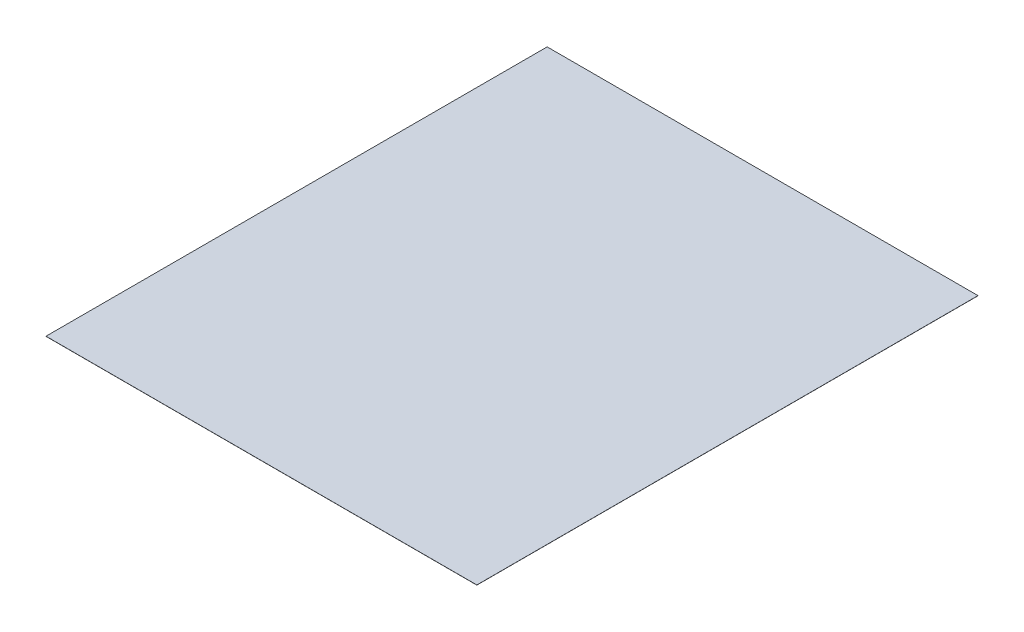
ISO-10303-21;
HEADER;
FILE_DESCRIPTION(('STEP AP214'),'2;1');
FILE_NAME('part.step','',(''),(''),'','','');
FILE_SCHEMA(('AUTOMOTIVE_DESIGN { 1 0 10303 214 1 1 1 1 }'));
ENDSEC;
DATA;
#1=APPLICATION_CONTEXT('core data for automotive mechanical design processes');
#2=APPLICATION_PROTOCOL_DEFINITION('international standard','automotive_design',2000,#1);
#3=PRODUCT_CONTEXT('',#1,'mechanical');
#4=PRODUCT('Part','Part','',(#3));
#5=PRODUCT_RELATED_PRODUCT_CATEGORY('part','',(#4));
#6=PRODUCT_DEFINITION_FORMATION('','',#4);
#7=PRODUCT_DEFINITION_CONTEXT('part definition',#1,'design');
#8=PRODUCT_DEFINITION('design','',#6,#7);
#9=PRODUCT_DEFINITION_SHAPE('','',#8);
#10=(LENGTH_UNIT() NAMED_UNIT(*) SI_UNIT(.MILLI.,.METRE.));
#11=(NAMED_UNIT(*) PLANE_ANGLE_UNIT() SI_UNIT($,.RADIAN.));
#12=(NAMED_UNIT(*) SI_UNIT($,.STERADIAN.) SOLID_ANGLE_UNIT());
#13=UNCERTAINTY_MEASURE_WITH_UNIT(LENGTH_MEASURE(1.E-05),#10,'distance_accuracy_value','');
#14=(GEOMETRIC_REPRESENTATION_CONTEXT(3) GLOBAL_UNCERTAINTY_ASSIGNED_CONTEXT((#13)) GLOBAL_UNIT_ASSIGNED_CONTEXT((#10,
#11,#12)) REPRESENTATION_CONTEXT('',''));
#15=CARTESIAN_POINT('',(0.,0.,0.));
#16=DIRECTION('',(0.,0.,1.));
#17=DIRECTION('',(1.,0.,0.));
#18=AXIS2_PLACEMENT_3D('',#15,#16,#17);
#19=CARTESIAN_POINT('',(0.,2.54,0.));
#20=DIRECTION('',(1.,0.,0.));
#21=DIRECTION('',(0.,0.,-1.));
#22=AXIS2_PLACEMENT_3D('',#19,#20,#21);
#23=PLANE('',#22);
#24=DIRECTION('',(0.,0.,1.));
#25=VECTOR('',#24,1.);
#26=CARTESIAN_POINT('',(0.,0.,0.));
#27=LINE('',#26,#25);
#28=CARTESIAN_POINT('',(0.,0.,-8509.));
#29=VERTEX_POINT('',#28);
#30=CARTESIAN_POINT('',(0.,0.,0.));
#31=VERTEX_POINT('',#30);
#32=EDGE_CURVE('E96',#29,#31,#27,.T.);
#33=ORIENTED_EDGE('',*,*,#32,.T.);
#34=DIRECTION('',(0.,-1.,0.));
#35=VECTOR('',#34,1.);
#36=CARTESIAN_POINT('',(0.,2.54,0.));
#37=LINE('',#36,#35);
#38=CARTESIAN_POINT('',(0.,2.54,0.));
#39=VERTEX_POINT('',#38);
#40=EDGE_CURVE('E11',#39,#31,#37,.T.);
#41=ORIENTED_EDGE('',*,*,#40,.F.);
#42=DIRECTION('',(0.,0.,1.));
#43=VECTOR('',#42,1.);
#44=CARTESIAN_POINT('',(0.,2.54,0.));
#45=LINE('',#44,#43);
#46=CARTESIAN_POINT('',(0.,2.54,-8509.));
#47=VERTEX_POINT('',#46);
#48=EDGE_CURVE('E84',#47,#39,#45,.T.);
#49=ORIENTED_EDGE('',*,*,#48,.F.);
#50=DIRECTION('',(0.,-1.,0.));
#51=VECTOR('',#50,1.);
#52=CARTESIAN_POINT('',(0.,2.54,-8509.));
#53=LINE('',#52,#51);
#54=EDGE_CURVE('E92',#47,#29,#53,.T.);
#55=ORIENTED_EDGE('',*,*,#54,.T.);
#56=EDGE_LOOP('',(#33,#41,#49,#55));
#57=FACE_BOUND('',#56,.T.);
#58=ADVANCED_FACE('F33',(#57),#23,.F.);
#59=CARTESIAN_POINT('',(0.,2.54,0.));
#60=DIRECTION('',(0.,0.,-1.));
#61=DIRECTION('',(-1.,0.,0.));
#62=AXIS2_PLACEMENT_3D('',#59,#60,#61);
#63=PLANE('',#62);
#64=DIRECTION('',(1.,0.,0.));
#65=VECTOR('',#64,1.);
#66=CARTESIAN_POINT('',(0.,0.,0.));
#67=LINE('',#66,#65);
#68=CARTESIAN_POINT('',(7315.2,0.,0.));
#69=VERTEX_POINT('',#68);
#70=EDGE_CURVE('E88',#31,#69,#67,.T.);
#71=ORIENTED_EDGE('',*,*,#70,.T.);
#72=DIRECTION('',(0.,-1.,0.));
#73=VECTOR('',#72,1.);
#74=CARTESIAN_POINT('',(7315.2,2.54,0.));
#75=LINE('',#74,#73);
#76=CARTESIAN_POINT('',(7315.2,2.54,0.));
#77=VERTEX_POINT('',#76);
#78=EDGE_CURVE('E41',#77,#69,#75,.T.);
#79=ORIENTED_EDGE('',*,*,#78,.F.);
#80=DIRECTION('',(1.,0.,0.));
#81=VECTOR('',#80,1.);
#82=CARTESIAN_POINT('',(0.,2.54,0.));
#83=LINE('',#82,#81);
#84=EDGE_CURVE('E79',#39,#77,#83,.T.);
#85=ORIENTED_EDGE('',*,*,#84,.F.);
#86=ORIENTED_EDGE('',*,*,#40,.T.);
#87=EDGE_LOOP('',(#71,#79,#85,#86));
#88=FACE_BOUND('',#87,.T.);
#89=ADVANCED_FACE('F87',(#88),#63,.F.);
#90=CARTESIAN_POINT('',(7315.2,2.54,0.));
#91=DIRECTION('',(-1.,0.,0.));
#92=DIRECTION('',(0.,0.,1.));
#93=AXIS2_PLACEMENT_3D('',#90,#91,#92);
#94=PLANE('',#93);
#95=DIRECTION('',(0.,0.,-1.));
#96=VECTOR('',#95,1.);
#97=CARTESIAN_POINT('',(7315.2,0.,0.));
#98=LINE('',#97,#96);
#99=CARTESIAN_POINT('',(7315.2,0.,-8509.));
#100=VERTEX_POINT('',#99);
#101=EDGE_CURVE('E66',#69,#100,#98,.T.);
#102=ORIENTED_EDGE('',*,*,#101,.T.);
#103=DIRECTION('',(0.,-1.,0.));
#104=VECTOR('',#103,1.);
#105=CARTESIAN_POINT('',(7315.2,2.54,-8509.));
#106=LINE('',#105,#104);
#107=CARTESIAN_POINT('',(7315.2,2.54,-8509.));
#108=VERTEX_POINT('',#107);
#109=EDGE_CURVE('E89',#108,#100,#106,.T.);
#110=ORIENTED_EDGE('',*,*,#109,.F.);
#111=DIRECTION('',(0.,0.,-1.));
#112=VECTOR('',#111,1.);
#113=CARTESIAN_POINT('',(7315.2,2.54,0.));
#114=LINE('',#113,#112);
#115=EDGE_CURVE('E82',#77,#108,#114,.T.);
#116=ORIENTED_EDGE('',*,*,#115,.F.);
#117=ORIENTED_EDGE('',*,*,#78,.T.);
#118=EDGE_LOOP('',(#102,#110,#116,#117));
#119=FACE_BOUND('',#118,.T.);
#120=ADVANCED_FACE('F90',(#119),#94,.F.);
#121=CARTESIAN_POINT('',(0.,2.54,-8509.));
#122=DIRECTION('',(0.,0.,1.));
#123=DIRECTION('',(1.,0.,0.));
#124=AXIS2_PLACEMENT_3D('',#121,#122,#123);
#125=PLANE('',#124);
#126=DIRECTION('',(-1.,0.,0.));
#127=VECTOR('',#126,1.);
#128=CARTESIAN_POINT('',(0.,0.,-8509.));
#129=LINE('',#128,#127);
#130=EDGE_CURVE('E72',#100,#29,#129,.T.);
#131=ORIENTED_EDGE('',*,*,#130,.T.);
#132=ORIENTED_EDGE('',*,*,#54,.F.);
#133=DIRECTION('',(-1.,0.,0.));
#134=VECTOR('',#133,1.);
#135=CARTESIAN_POINT('',(0.,2.54,-8509.));
#136=LINE('',#135,#134);
#137=EDGE_CURVE('E49',#108,#47,#136,.T.);
#138=ORIENTED_EDGE('',*,*,#137,.F.);
#139=ORIENTED_EDGE('',*,*,#109,.T.);
#140=EDGE_LOOP('',(#131,#132,#138,#139));
#141=FACE_BOUND('',#140,.T.);
#142=ADVANCED_FACE('F103',(#141),#125,.F.);
#143=CARTESIAN_POINT('',(0.,2.54,0.));
#144=DIRECTION('',(0.,-1.,0.));
#145=DIRECTION('',(0.,0.,-1.));
#146=AXIS2_PLACEMENT_3D('',#143,#144,#145);
#147=PLANE('',#146);
#148=ORIENTED_EDGE('',*,*,#48,.T.);
#149=ORIENTED_EDGE('',*,*,#84,.T.);
#150=ORIENTED_EDGE('',*,*,#115,.T.);
#151=ORIENTED_EDGE('',*,*,#137,.T.);
#152=EDGE_LOOP('',(#148,#149,#150,#151));
#153=FACE_BOUND('',#152,.T.);
#154=ADVANCED_FACE('F80',(#153),#147,.F.);
#155=CARTESIAN_POINT('',(0.,0.,0.));
#156=DIRECTION('',(0.,-1.,0.));
#157=DIRECTION('',(0.,0.,-1.));
#158=AXIS2_PLACEMENT_3D('',#155,#156,#157);
#159=PLANE('',#158);
#160=ORIENTED_EDGE('',*,*,#32,.F.);
#161=ORIENTED_EDGE('',*,*,#130,.F.);
#162=ORIENTED_EDGE('',*,*,#101,.F.);
#163=ORIENTED_EDGE('',*,*,#70,.F.);
#164=EDGE_LOOP('',(#160,#161,#162,#163));
#165=FACE_BOUND('',#164,.T.);
#166=ADVANCED_FACE('F106',(#165),#159,.T.);
#167=CLOSED_SHELL('',(#58,#89,#120,#142,#154,#166));
#168=MANIFOLD_SOLID_BREP('B2',#167);
#169=ADVANCED_BREP_SHAPE_REPRESENTATION('',(#18,#168),#14);
#170=SHAPE_DEFINITION_REPRESENTATION(#9,#169);
ENDSEC;
END-ISO-10303-21;
